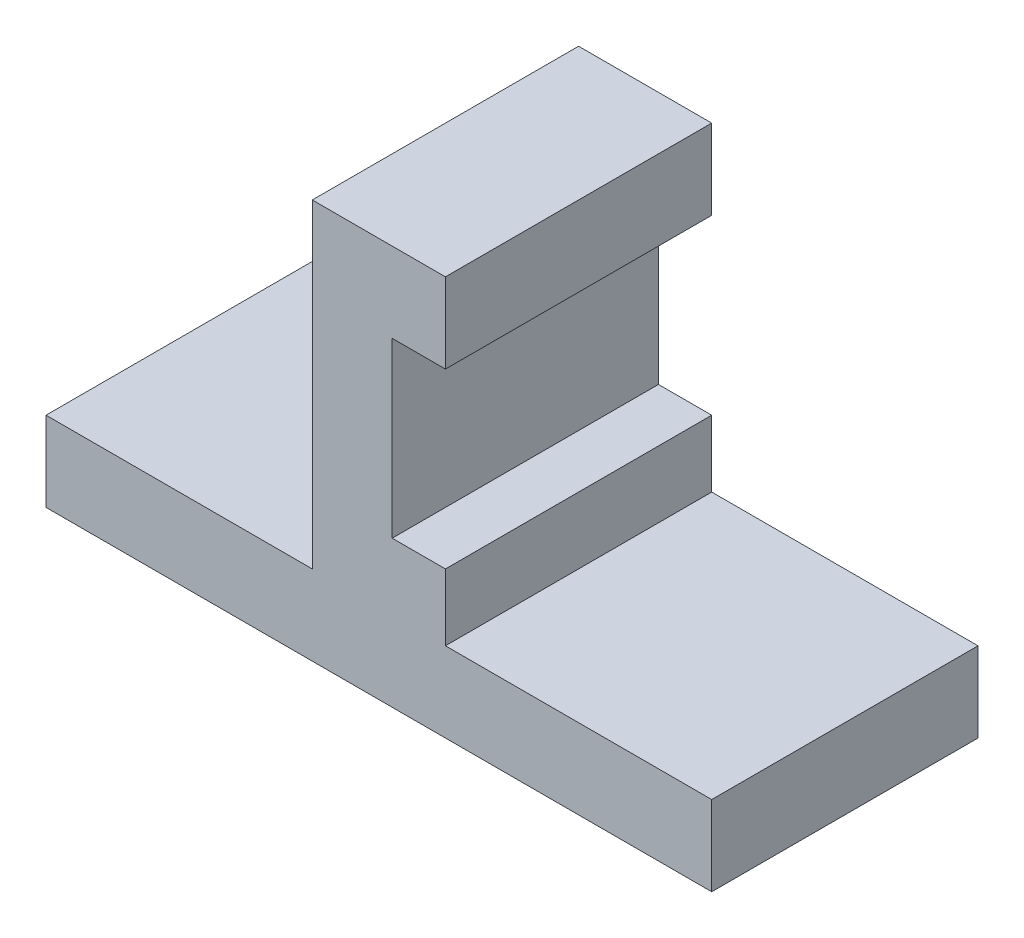
ISO-10303-21;
HEADER;
FILE_DESCRIPTION(('STEP AP214'),'2;1');
FILE_NAME('part.step','',(''),(''),'','','');
FILE_SCHEMA(('AUTOMOTIVE_DESIGN { 1 0 10303 214 1 1 1 1 }'));
ENDSEC;
DATA;
#1=APPLICATION_CONTEXT('core data for automotive mechanical design processes');
#2=APPLICATION_PROTOCOL_DEFINITION('international standard','automotive_design',2000,#1);
#3=PRODUCT_CONTEXT('',#1,'mechanical');
#4=PRODUCT('Part','Part','',(#3));
#5=PRODUCT_RELATED_PRODUCT_CATEGORY('part','',(#4));
#6=PRODUCT_DEFINITION_FORMATION('','',#4);
#7=PRODUCT_DEFINITION_CONTEXT('part definition',#1,'design');
#8=PRODUCT_DEFINITION('design','',#6,#7);
#9=PRODUCT_DEFINITION_SHAPE('','',#8);
#10=(LENGTH_UNIT() NAMED_UNIT(*) SI_UNIT(.MILLI.,.METRE.));
#11=(NAMED_UNIT(*) PLANE_ANGLE_UNIT() SI_UNIT($,.RADIAN.));
#12=(NAMED_UNIT(*) SI_UNIT($,.STERADIAN.) SOLID_ANGLE_UNIT());
#13=UNCERTAINTY_MEASURE_WITH_UNIT(LENGTH_MEASURE(1.E-05),#10,'distance_accuracy_value','');
#14=(GEOMETRIC_REPRESENTATION_CONTEXT(3) GLOBAL_UNCERTAINTY_ASSIGNED_CONTEXT((#13)) GLOBAL_UNIT_ASSIGNED_CONTEXT((#10,
#11,#12)) REPRESENTATION_CONTEXT('',''));
#15=CARTESIAN_POINT('',(0.,0.,0.));
#16=DIRECTION('',(0.,0.,1.));
#17=DIRECTION('',(1.,0.,0.));
#18=AXIS2_PLACEMENT_3D('',#15,#16,#17);
#19=CARTESIAN_POINT('',(2.5,15.,-5.));
#20=DIRECTION('',(-1.,0.,0.));
#21=DIRECTION('',(0.,0.,1.));
#22=AXIS2_PLACEMENT_3D('',#19,#20,#21);
#23=PLANE('',#22);
#24=DIRECTION('',(0.,-1.,0.));
#25=VECTOR('',#24,1.);
#26=CARTESIAN_POINT('',(2.5,15.,-5.));
#27=LINE('',#26,#25);
#28=CARTESIAN_POINT('',(2.5,5.5,-5.));
#29=VERTEX_POINT('',#28);
#30=CARTESIAN_POINT('',(2.5,3.,-5.));
#31=VERTEX_POINT('',#30);
#32=EDGE_CURVE('E196',#29,#31,#27,.T.);
#33=ORIENTED_EDGE('',*,*,#32,.F.);
#34=DIRECTION('',(0.,0.,-1.));
#35=VECTOR('',#34,1.);
#36=CARTESIAN_POINT('',(2.5,5.5,5.));
#37=LINE('',#36,#35);
#38=CARTESIAN_POINT('',(2.5,5.5,5.));
#39=VERTEX_POINT('',#38);
#40=EDGE_CURVE('E148',#39,#29,#37,.T.);
#41=ORIENTED_EDGE('',*,*,#40,.F.);
#42=DIRECTION('',(0.,-1.,0.));
#43=VECTOR('',#42,1.);
#44=CARTESIAN_POINT('',(2.5,15.,5.));
#45=LINE('',#44,#43);
#46=CARTESIAN_POINT('',(2.5,3.,5.));
#47=VERTEX_POINT('',#46);
#48=EDGE_CURVE('E63',#39,#47,#45,.T.);
#49=ORIENTED_EDGE('',*,*,#48,.T.);
#50=DIRECTION('',(0.,0.,-1.));
#51=VECTOR('',#50,1.);
#52=CARTESIAN_POINT('',(2.5,3.,-5.));
#53=LINE('',#52,#51);
#54=EDGE_CURVE('E177',#47,#31,#53,.T.);
#55=ORIENTED_EDGE('',*,*,#54,.T.);
#56=EDGE_LOOP('',(#33,#41,#49,#55));
#57=FACE_BOUND('',#56,.T.);
#58=ADVANCED_FACE('F39',(#57),#23,.F.);
#59=CARTESIAN_POINT('',(0.,3.,0.));
#60=DIRECTION('',(0.,1.,0.));
#61=DIRECTION('',(0.,0.,1.));
#62=AXIS2_PLACEMENT_3D('',#59,#60,#61);
#63=PLANE('',#62);
#64=ORIENTED_EDGE('',*,*,#54,.F.);
#65=DIRECTION('',(1.,0.,0.));
#66=VECTOR('',#65,1.);
#67=CARTESIAN_POINT('',(-12.5,3.,5.));
#68=LINE('',#67,#66);
#69=CARTESIAN_POINT('',(12.5,3.,5.));
#70=VERTEX_POINT('',#69);
#71=EDGE_CURVE('E213',#47,#70,#68,.T.);
#72=ORIENTED_EDGE('',*,*,#71,.T.);
#73=DIRECTION('',(0.,0.,-1.));
#74=VECTOR('',#73,1.);
#75=CARTESIAN_POINT('',(12.5,3.,-5.));
#76=LINE('',#75,#74);
#77=CARTESIAN_POINT('',(12.5,3.,-5.));
#78=VERTEX_POINT('',#77);
#79=EDGE_CURVE('E200',#70,#78,#76,.T.);
#80=ORIENTED_EDGE('',*,*,#79,.T.);
#81=DIRECTION('',(-1.,0.,0.));
#82=VECTOR('',#81,1.);
#83=CARTESIAN_POINT('',(-12.5,3.,-5.));
#84=LINE('',#83,#82);
#85=EDGE_CURVE('E206',#78,#31,#84,.T.);
#86=ORIENTED_EDGE('',*,*,#85,.T.);
#87=EDGE_LOOP('',(#64,#72,#80,#86));
#88=FACE_BOUND('',#87,.T.);
#89=ADVANCED_FACE('F257',(#88),#63,.T.);
#90=CARTESIAN_POINT('',(12.5,3.,-5.));
#91=DIRECTION('',(-1.,0.,0.));
#92=DIRECTION('',(0.,0.,1.));
#93=AXIS2_PLACEMENT_3D('',#90,#91,#92);
#94=PLANE('',#93);
#95=DIRECTION('',(0.,0.,-1.));
#96=VECTOR('',#95,1.);
#97=CARTESIAN_POINT('',(12.5,0.,-5.));
#98=LINE('',#97,#96);
#99=CARTESIAN_POINT('',(12.5,0.,5.));
#100=VERTEX_POINT('',#99);
#101=CARTESIAN_POINT('',(12.5,0.,-5.));
#102=VERTEX_POINT('',#101);
#103=EDGE_CURVE('E199',#100,#102,#98,.T.);
#104=ORIENTED_EDGE('',*,*,#103,.T.);
#105=DIRECTION('',(0.,-1.,0.));
#106=VECTOR('',#105,1.);
#107=CARTESIAN_POINT('',(12.5,3.,-5.));
#108=LINE('',#107,#106);
#109=EDGE_CURVE('E11',#78,#102,#108,.T.);
#110=ORIENTED_EDGE('',*,*,#109,.F.);
#111=ORIENTED_EDGE('',*,*,#79,.F.);
#112=DIRECTION('',(0.,-1.,0.));
#113=VECTOR('',#112,1.);
#114=CARTESIAN_POINT('',(12.5,3.,5.));
#115=LINE('',#114,#113);
#116=EDGE_CURVE('E217',#70,#100,#115,.T.);
#117=ORIENTED_EDGE('',*,*,#116,.T.);
#118=EDGE_LOOP('',(#104,#110,#111,#117));
#119=FACE_BOUND('',#118,.T.);
#120=ADVANCED_FACE('F41',(#119),#94,.F.);
#121=CARTESIAN_POINT('',(-12.5,3.,-5.));
#122=DIRECTION('',(0.,0.,1.));
#123=DIRECTION('',(1.,0.,0.));
#124=AXIS2_PLACEMENT_3D('',#121,#122,#123);
#125=PLANE('',#124);
#126=DIRECTION('',(0.,1.,0.));
#127=VECTOR('',#126,1.);
#128=CARTESIAN_POINT('',(0.5,12.,-5.));
#129=LINE('',#128,#127);
#130=CARTESIAN_POINT('',(0.5,5.5,-5.));
#131=VERTEX_POINT('',#130);
#132=CARTESIAN_POINT('',(0.5,12.,-5.));
#133=VERTEX_POINT('',#132);
#134=EDGE_CURVE('E138',#131,#133,#129,.T.);
#135=ORIENTED_EDGE('',*,*,#134,.F.);
#136=DIRECTION('',(1.,0.,0.));
#137=VECTOR('',#136,1.);
#138=CARTESIAN_POINT('',(0.5,5.5,-5.));
#139=LINE('',#138,#137);
#140=EDGE_CURVE('E180',#131,#29,#139,.T.);
#141=ORIENTED_EDGE('',*,*,#140,.T.);
#142=ORIENTED_EDGE('',*,*,#32,.T.);
#143=ORIENTED_EDGE('',*,*,#85,.F.);
#144=ORIENTED_EDGE('',*,*,#109,.T.);
#145=DIRECTION('',(-1.,0.,0.));
#146=VECTOR('',#145,1.);
#147=CARTESIAN_POINT('',(-12.5,0.,-5.));
#148=LINE('',#147,#146);
#149=CARTESIAN_POINT('',(-12.5,0.,-5.));
#150=VERTEX_POINT('',#149);
#151=EDGE_CURVE('E221',#102,#150,#148,.T.);
#152=ORIENTED_EDGE('',*,*,#151,.T.);
#153=DIRECTION('',(0.,-1.,0.));
#154=VECTOR('',#153,1.);
#155=CARTESIAN_POINT('',(-12.5,3.,-5.));
#156=LINE('',#155,#154);
#157=CARTESIAN_POINT('',(-12.5,3.,-5.));
#158=VERTEX_POINT('',#157);
#159=EDGE_CURVE('E48',#158,#150,#156,.T.);
#160=ORIENTED_EDGE('',*,*,#159,.F.);
#161=CARTESIAN_POINT('',(-2.5,3.,-5.));
#162=VERTEX_POINT('',#161);
#163=EDGE_CURVE('E204',#162,#158,#84,.T.);
#164=ORIENTED_EDGE('',*,*,#163,.F.);
#165=DIRECTION('',(0.,-1.,0.));
#166=VECTOR('',#165,1.);
#167=CARTESIAN_POINT('',(-2.5,15.,-5.));
#168=LINE('',#167,#166);
#169=CARTESIAN_POINT('',(-2.5,15.,-5.));
#170=VERTEX_POINT('',#169);
#171=EDGE_CURVE('E192',#170,#162,#168,.T.);
#172=ORIENTED_EDGE('',*,*,#171,.F.);
#173=DIRECTION('',(-1.,0.,0.));
#174=VECTOR('',#173,1.);
#175=CARTESIAN_POINT('',(-2.5,15.,-5.));
#176=LINE('',#175,#174);
#177=CARTESIAN_POINT('',(2.5,15.,-5.));
#178=VERTEX_POINT('',#177);
#179=EDGE_CURVE('E167',#178,#170,#176,.T.);
#180=ORIENTED_EDGE('',*,*,#179,.F.);
#181=CARTESIAN_POINT('',(2.5,12.,-5.));
#182=VERTEX_POINT('',#181);
#183=EDGE_CURVE('E153',#178,#182,#27,.T.);
#184=ORIENTED_EDGE('',*,*,#183,.T.);
#185=DIRECTION('',(1.,0.,0.));
#186=VECTOR('',#185,1.);
#187=CARTESIAN_POINT('',(0.5,12.,-5.));
#188=LINE('',#187,#186);
#189=EDGE_CURVE('E55',#133,#182,#188,.T.);
#190=ORIENTED_EDGE('',*,*,#189,.F.);
#191=EDGE_LOOP('',(#135,#141,#142,#143,#144,#152,#160,#164,#172,#180,#184,#190));
#192=FACE_BOUND('',#191,.T.);
#193=ADVANCED_FACE('F151',(#192),#125,.F.);
#194=CARTESIAN_POINT('',(-12.5,3.,-5.));
#195=DIRECTION('',(1.,0.,0.));
#196=DIRECTION('',(0.,0.,-1.));
#197=AXIS2_PLACEMENT_3D('',#194,#195,#196);
#198=PLANE('',#197);
#199=DIRECTION('',(0.,0.,1.));
#200=VECTOR('',#199,1.);
#201=CARTESIAN_POINT('',(-12.5,0.,-5.));
#202=LINE('',#201,#200);
#203=CARTESIAN_POINT('',(-12.5,0.,5.));
#204=VERTEX_POINT('',#203);
#205=EDGE_CURVE('E224',#150,#204,#202,.T.);
#206=ORIENTED_EDGE('',*,*,#205,.T.);
#207=DIRECTION('',(0.,-1.,0.));
#208=VECTOR('',#207,1.);
#209=CARTESIAN_POINT('',(-12.5,3.,5.));
#210=LINE('',#209,#208);
#211=CARTESIAN_POINT('',(-12.5,3.,5.));
#212=VERTEX_POINT('',#211);
#213=EDGE_CURVE('E232',#212,#204,#210,.T.);
#214=ORIENTED_EDGE('',*,*,#213,.F.);
#215=DIRECTION('',(0.,0.,1.));
#216=VECTOR('',#215,1.);
#217=CARTESIAN_POINT('',(-12.5,3.,-5.));
#218=LINE('',#217,#216);
#219=EDGE_CURVE('E210',#158,#212,#218,.T.);
#220=ORIENTED_EDGE('',*,*,#219,.F.);
#221=ORIENTED_EDGE('',*,*,#159,.T.);
#222=EDGE_LOOP('',(#206,#214,#220,#221));
#223=FACE_BOUND('',#222,.T.);
#224=ADVANCED_FACE('F241',(#223),#198,.F.);
#225=CARTESIAN_POINT('',(-12.5,3.,5.));
#226=DIRECTION('',(0.,0.,-1.));
#227=DIRECTION('',(-1.,0.,0.));
#228=AXIS2_PLACEMENT_3D('',#225,#226,#227);
#229=PLANE('',#228);
#230=ORIENTED_EDGE('',*,*,#48,.F.);
#231=DIRECTION('',(1.,0.,0.));
#232=VECTOR('',#231,1.);
#233=CARTESIAN_POINT('',(0.5,5.5,5.));
#234=LINE('',#233,#232);
#235=CARTESIAN_POINT('',(0.5,5.5,5.));
#236=VERTEX_POINT('',#235);
#237=EDGE_CURVE('E158',#236,#39,#234,.T.);
#238=ORIENTED_EDGE('',*,*,#237,.F.);
#239=DIRECTION('',(0.,-1.,0.));
#240=VECTOR('',#239,1.);
#241=CARTESIAN_POINT('',(0.5,12.,5.));
#242=LINE('',#241,#240);
#243=CARTESIAN_POINT('',(0.5,12.,5.));
#244=VERTEX_POINT('',#243);
#245=EDGE_CURVE('E137',#244,#236,#242,.T.);
#246=ORIENTED_EDGE('',*,*,#245,.F.);
#247=DIRECTION('',(1.,0.,0.));
#248=VECTOR('',#247,1.);
#249=CARTESIAN_POINT('',(0.5,12.,5.));
#250=LINE('',#249,#248);
#251=CARTESIAN_POINT('',(2.5,12.,5.));
#252=VERTEX_POINT('',#251);
#253=EDGE_CURVE('E133',#244,#252,#250,.T.);
#254=ORIENTED_EDGE('',*,*,#253,.T.);
#255=CARTESIAN_POINT('',(2.5,15.,5.));
#256=VERTEX_POINT('',#255);
#257=EDGE_CURVE('E184',#256,#252,#45,.T.);
#258=ORIENTED_EDGE('',*,*,#257,.F.);
#259=DIRECTION('',(1.,0.,0.));
#260=VECTOR('',#259,1.);
#261=CARTESIAN_POINT('',(-2.5,15.,5.));
#262=LINE('',#261,#260);
#263=CARTESIAN_POINT('',(-2.5,15.,5.));
#264=VERTEX_POINT('',#263);
#265=EDGE_CURVE('E174',#264,#256,#262,.T.);
#266=ORIENTED_EDGE('',*,*,#265,.F.);
#267=DIRECTION('',(0.,-1.,0.));
#268=VECTOR('',#267,1.);
#269=CARTESIAN_POINT('',(-2.5,15.,5.));
#270=LINE('',#269,#268);
#271=CARTESIAN_POINT('',(-2.5,3.,5.));
#272=VERTEX_POINT('',#271);
#273=EDGE_CURVE('E188',#264,#272,#270,.T.);
#274=ORIENTED_EDGE('',*,*,#273,.T.);
#275=EDGE_CURVE('E214',#212,#272,#68,.T.);
#276=ORIENTED_EDGE('',*,*,#275,.F.);
#277=ORIENTED_EDGE('',*,*,#213,.T.);
#278=DIRECTION('',(1.,0.,0.));
#279=VECTOR('',#278,1.);
#280=CARTESIAN_POINT('',(-12.5,0.,5.));
#281=LINE('',#280,#279);
#282=EDGE_CURVE('E205',#204,#100,#281,.T.);
#283=ORIENTED_EDGE('',*,*,#282,.T.);
#284=ORIENTED_EDGE('',*,*,#116,.F.);
#285=ORIENTED_EDGE('',*,*,#71,.F.);
#286=EDGE_LOOP('',(#230,#238,#246,#254,#258,#266,#274,#276,#277,#283,#284,#285));
#287=FACE_BOUND('',#286,.T.);
#288=ADVANCED_FACE('F250',(#287),#229,.F.);
#289=DIRECTION('',(0.,0.,1.));
#290=VECTOR('',#289,1.);
#291=CARTESIAN_POINT('',(-2.5,3.,-5.));
#292=LINE('',#291,#290);
#293=EDGE_CURVE('E168',#162,#272,#292,.T.);
#294=ORIENTED_EDGE('',*,*,#293,.F.);
#295=ORIENTED_EDGE('',*,*,#163,.T.);
#296=ORIENTED_EDGE('',*,*,#219,.T.);
#297=ORIENTED_EDGE('',*,*,#275,.T.);
#298=EDGE_LOOP('',(#294,#295,#296,#297));
#299=FACE_BOUND('',#298,.T.);
#300=ADVANCED_FACE('F283',(#299),#63,.T.);
#301=CARTESIAN_POINT('',(0.,0.,0.));
#302=DIRECTION('',(0.,1.,0.));
#303=DIRECTION('',(0.,0.,1.));
#304=AXIS2_PLACEMENT_3D('',#301,#302,#303);
#305=PLANE('',#304);
#306=ORIENTED_EDGE('',*,*,#103,.F.);
#307=ORIENTED_EDGE('',*,*,#282,.F.);
#308=ORIENTED_EDGE('',*,*,#205,.F.);
#309=ORIENTED_EDGE('',*,*,#151,.F.);
#310=EDGE_LOOP('',(#306,#307,#308,#309));
#311=FACE_BOUND('',#310,.T.);
#312=ADVANCED_FACE('F247',(#311),#305,.F.);
#313=ORIENTED_EDGE('',*,*,#257,.T.);
#314=DIRECTION('',(0.,0.,1.));
#315=VECTOR('',#314,1.);
#316=CARTESIAN_POINT('',(2.5,12.,5.));
#317=LINE('',#316,#315);
#318=EDGE_CURVE('E270',#182,#252,#317,.T.);
#319=ORIENTED_EDGE('',*,*,#318,.F.);
#320=ORIENTED_EDGE('',*,*,#183,.F.);
#321=DIRECTION('',(0.,0.,-1.));
#322=VECTOR('',#321,1.);
#323=CARTESIAN_POINT('',(2.5,15.,-5.));
#324=LINE('',#323,#322);
#325=EDGE_CURVE('E163',#256,#178,#324,.T.);
#326=ORIENTED_EDGE('',*,*,#325,.F.);
#327=EDGE_LOOP('',(#313,#319,#320,#326));
#328=FACE_BOUND('',#327,.T.);
#329=ADVANCED_FACE('F278',(#328),#23,.F.);
#330=CARTESIAN_POINT('',(-2.5,15.,-5.));
#331=DIRECTION('',(1.,0.,0.));
#332=DIRECTION('',(0.,0.,-1.));
#333=AXIS2_PLACEMENT_3D('',#330,#331,#332);
#334=PLANE('',#333);
#335=ORIENTED_EDGE('',*,*,#293,.T.);
#336=ORIENTED_EDGE('',*,*,#273,.F.);
#337=DIRECTION('',(0.,0.,1.));
#338=VECTOR('',#337,1.);
#339=CARTESIAN_POINT('',(-2.5,15.,-5.));
#340=LINE('',#339,#338);
#341=EDGE_CURVE('E171',#170,#264,#340,.T.);
#342=ORIENTED_EDGE('',*,*,#341,.F.);
#343=ORIENTED_EDGE('',*,*,#171,.T.);
#344=EDGE_LOOP('',(#335,#336,#342,#343));
#345=FACE_BOUND('',#344,.T.);
#346=ADVANCED_FACE('F286',(#345),#334,.F.);
#347=CARTESIAN_POINT('',(0.,15.,0.));
#348=DIRECTION('',(0.,1.,0.));
#349=DIRECTION('',(0.,0.,1.));
#350=AXIS2_PLACEMENT_3D('',#347,#348,#349);
#351=PLANE('',#350);
#352=ORIENTED_EDGE('',*,*,#325,.T.);
#353=ORIENTED_EDGE('',*,*,#179,.T.);
#354=ORIENTED_EDGE('',*,*,#341,.T.);
#355=ORIENTED_EDGE('',*,*,#265,.T.);
#356=EDGE_LOOP('',(#352,#353,#354,#355));
#357=FACE_BOUND('',#356,.T.);
#358=ADVANCED_FACE('F292',(#357),#351,.T.);
#359=CARTESIAN_POINT('',(0.5,5.5,5.));
#360=DIRECTION('',(0.,-1.,0.));
#361=DIRECTION('',(0.,0.,-1.));
#362=AXIS2_PLACEMENT_3D('',#359,#360,#361);
#363=PLANE('',#362);
#364=ORIENTED_EDGE('',*,*,#40,.T.);
#365=ORIENTED_EDGE('',*,*,#140,.F.);
#366=DIRECTION('',(0.,0.,-1.));
#367=VECTOR('',#366,1.);
#368=CARTESIAN_POINT('',(0.5,5.5,5.));
#369=LINE('',#368,#367);
#370=EDGE_CURVE('E144',#236,#131,#369,.T.);
#371=ORIENTED_EDGE('',*,*,#370,.F.);
#372=ORIENTED_EDGE('',*,*,#237,.T.);
#373=EDGE_LOOP('',(#364,#365,#371,#372));
#374=FACE_BOUND('',#373,.T.);
#375=ADVANCED_FACE('F274',(#374),#363,.F.);
#376=CARTESIAN_POINT('',(0.5,12.,5.));
#377=DIRECTION('',(0.,1.,0.));
#378=DIRECTION('',(0.,0.,1.));
#379=AXIS2_PLACEMENT_3D('',#376,#377,#378);
#380=PLANE('',#379);
#381=ORIENTED_EDGE('',*,*,#318,.T.);
#382=ORIENTED_EDGE('',*,*,#253,.F.);
#383=DIRECTION('',(0.,0.,1.));
#384=VECTOR('',#383,1.);
#385=CARTESIAN_POINT('',(0.5,12.,5.));
#386=LINE('',#385,#384);
#387=EDGE_CURVE('E129',#133,#244,#386,.T.);
#388=ORIENTED_EDGE('',*,*,#387,.F.);
#389=ORIENTED_EDGE('',*,*,#189,.T.);
#390=EDGE_LOOP('',(#381,#382,#388,#389));
#391=FACE_BOUND('',#390,.T.);
#392=ADVANCED_FACE('F131',(#391),#380,.F.);
#393=CARTESIAN_POINT('',(0.5,0.,0.));
#394=DIRECTION('',(1.,0.,0.));
#395=DIRECTION('',(0.,0.,-1.));
#396=AXIS2_PLACEMENT_3D('',#393,#394,#395);
#397=PLANE('',#396);
#398=ORIENTED_EDGE('',*,*,#134,.T.);
#399=ORIENTED_EDGE('',*,*,#387,.T.);
#400=ORIENTED_EDGE('',*,*,#245,.T.);
#401=ORIENTED_EDGE('',*,*,#370,.T.);
#402=EDGE_LOOP('',(#398,#399,#400,#401));
#403=FACE_BOUND('',#402,.T.);
#404=ADVANCED_FACE('F142',(#403),#397,.T.);
#405=CLOSED_SHELL('',(#58,#89,#120,#193,#224,#288,#300,#312,#329,#346,#358,#375,#392,#404));
#406=MANIFOLD_SOLID_BREP('B2',#405);
#407=ADVANCED_BREP_SHAPE_REPRESENTATION('',(#18,#406),#14);
#408=SHAPE_DEFINITION_REPRESENTATION(#9,#407);
ENDSEC;
END-ISO-10303-21;
